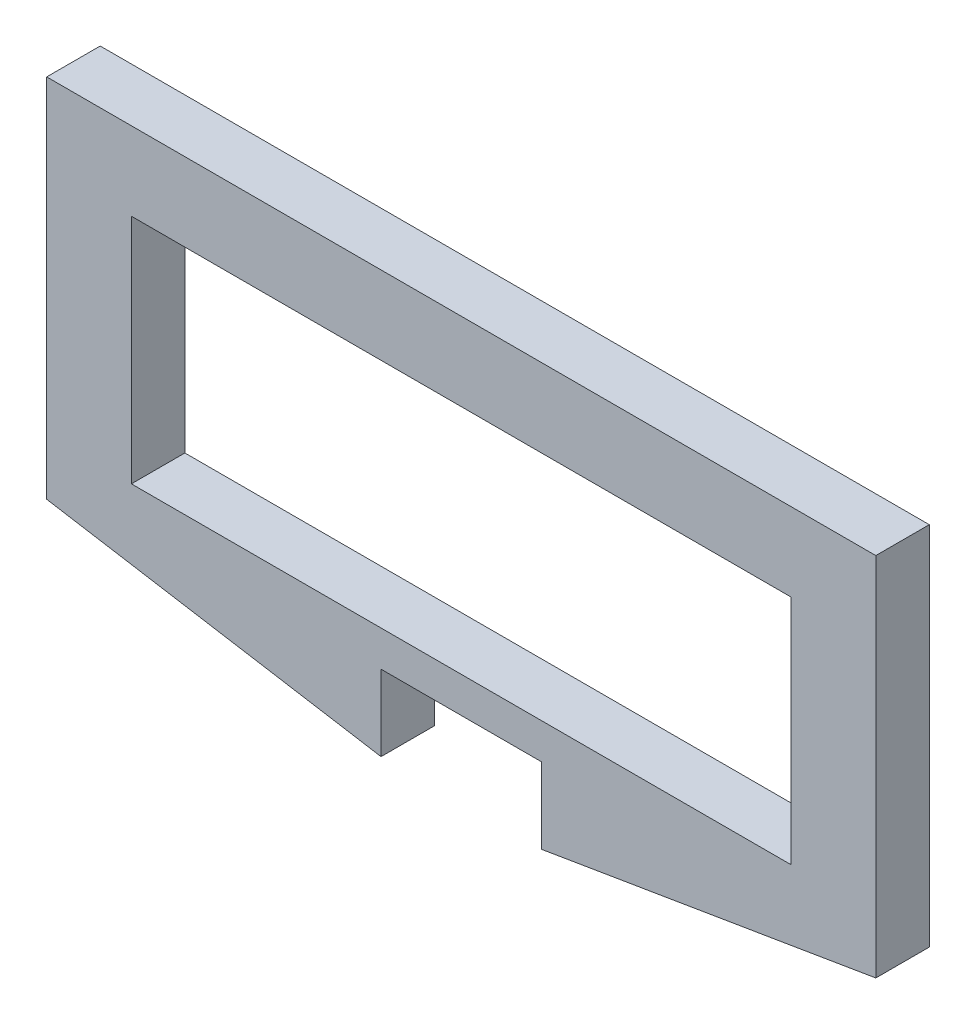
ISO-10303-21;
HEADER;
FILE_DESCRIPTION(('STEP AP214'),'2;1');
FILE_NAME('part.step','',(''),(''),'','','');
FILE_SCHEMA(('AUTOMOTIVE_DESIGN { 1 0 10303 214 1 1 1 1 }'));
ENDSEC;
DATA;
#1=APPLICATION_CONTEXT('core data for automotive mechanical design processes');
#2=APPLICATION_PROTOCOL_DEFINITION('international standard','automotive_design',2000,#1);
#3=PRODUCT_CONTEXT('',#1,'mechanical');
#4=PRODUCT('Part','Part','',(#3));
#5=PRODUCT_RELATED_PRODUCT_CATEGORY('part','',(#4));
#6=PRODUCT_DEFINITION_FORMATION('','',#4);
#7=PRODUCT_DEFINITION_CONTEXT('part definition',#1,'design');
#8=PRODUCT_DEFINITION('design','',#6,#7);
#9=PRODUCT_DEFINITION_SHAPE('','',#8);
#10=(LENGTH_UNIT() NAMED_UNIT(*) SI_UNIT(.MILLI.,.METRE.));
#11=(NAMED_UNIT(*) PLANE_ANGLE_UNIT() SI_UNIT($,.RADIAN.));
#12=(NAMED_UNIT(*) SI_UNIT($,.STERADIAN.) SOLID_ANGLE_UNIT());
#13=UNCERTAINTY_MEASURE_WITH_UNIT(LENGTH_MEASURE(1.E-05),#10,'distance_accuracy_value','');
#14=(GEOMETRIC_REPRESENTATION_CONTEXT(3) GLOBAL_UNCERTAINTY_ASSIGNED_CONTEXT((#13)) GLOBAL_UNIT_ASSIGNED_CONTEXT((#10,
#11,#12)) REPRESENTATION_CONTEXT('',''));
#15=CARTESIAN_POINT('',(0.,0.,0.));
#16=DIRECTION('',(0.,0.,1.));
#17=DIRECTION('',(1.,0.,0.));
#18=AXIS2_PLACEMENT_3D('',#15,#16,#17);
#19=CARTESIAN_POINT('',(0.,0.,30.));
#20=DIRECTION('',(0.,0.,1.));
#21=DIRECTION('',(1.,0.,0.));
#22=AXIS2_PLACEMENT_3D('',#19,#20,#21);
#23=PLANE('',#22);
#24=DIRECTION('',(0.,-1.,0.));
#25=VECTOR('',#24,1.);
#26=CARTESIAN_POINT('',(-232.49,9.89118189426478,30.));
#27=LINE('',#26,#25);
#28=CARTESIAN_POINT('',(-232.49,9.89118189426478,30.));
#29=VERTEX_POINT('',#28);
#30=CARTESIAN_POINT('',(-232.49,-195.288818105735,30.));
#31=VERTEX_POINT('',#30);
#32=EDGE_CURVE('E157',#29,#31,#27,.T.);
#33=ORIENTED_EDGE('',*,*,#32,.T.);
#34=DIRECTION('',(0.986400586141853,-0.164359008451041,0.));
#35=VECTOR('',#34,1.);
#36=CARTESIAN_POINT('',(-232.49,-195.288818105735,30.));
#37=LINE('',#36,#35);
#38=CARTESIAN_POINT('',(-45.,-226.529341405723,30.));
#39=VERTEX_POINT('',#38);
#40=EDGE_CURVE('E160',#31,#39,#37,.T.);
#41=ORIENTED_EDGE('',*,*,#40,.T.);
#42=DIRECTION('',(0.,1.,0.));
#43=VECTOR('',#42,1.);
#44=CARTESIAN_POINT('',(-45.,-226.529341405723,30.));
#45=LINE('',#44,#43);
#46=CARTESIAN_POINT('',(-45.,-184.029341405723,30.));
#47=VERTEX_POINT('',#46);
#48=EDGE_CURVE('E163',#39,#47,#45,.T.);
#49=ORIENTED_EDGE('',*,*,#48,.T.);
#50=DIRECTION('',(1.,0.,0.));
#51=VECTOR('',#50,1.);
#52=CARTESIAN_POINT('',(-45.,-184.029341405723,30.));
#53=LINE('',#52,#51);
#54=CARTESIAN_POINT('',(45.,-184.029341405723,30.));
#55=VERTEX_POINT('',#54);
#56=EDGE_CURVE('E165',#47,#55,#53,.T.);
#57=ORIENTED_EDGE('',*,*,#56,.T.);
#58=DIRECTION('',(0.,-1.,0.));
#59=VECTOR('',#58,1.);
#60=CARTESIAN_POINT('',(45.,-226.529341405723,30.));
#61=LINE('',#60,#59);
#62=CARTESIAN_POINT('',(45.,-226.529341405723,30.));
#63=VERTEX_POINT('',#62);
#64=EDGE_CURVE('E167',#55,#63,#61,.T.);
#65=ORIENTED_EDGE('',*,*,#64,.T.);
#66=DIRECTION('',(0.986400586141853,0.164359008451041,0.));
#67=VECTOR('',#66,1.);
#68=CARTESIAN_POINT('',(232.49,-195.288818105735,30.));
#69=LINE('',#68,#67);
#70=CARTESIAN_POINT('',(232.49,-195.288818105735,30.));
#71=VERTEX_POINT('',#70);
#72=EDGE_CURVE('E169',#63,#71,#69,.T.);
#73=ORIENTED_EDGE('',*,*,#72,.T.);
#74=DIRECTION('',(0.,1.,0.));
#75=VECTOR('',#74,1.);
#76=CARTESIAN_POINT('',(232.49,9.89118189426467,30.));
#77=LINE('',#76,#75);
#78=CARTESIAN_POINT('',(232.49,9.89118189426467,30.));
#79=VERTEX_POINT('',#78);
#80=EDGE_CURVE('E171',#71,#79,#77,.T.);
#81=ORIENTED_EDGE('',*,*,#80,.T.);
#82=DIRECTION('',(-1.,0.,0.));
#83=VECTOR('',#82,1.);
#84=CARTESIAN_POINT('',(232.49,9.89118189426467,30.));
#85=LINE('',#84,#83);
#86=EDGE_CURVE('E173',#79,#29,#85,.T.);
#87=ORIENTED_EDGE('',*,*,#86,.T.);
#88=EDGE_LOOP('',(#33,#41,#49,#57,#65,#73,#81,#87));
#89=FACE_BOUND('',#88,.T.);
#90=DIRECTION('',(0.,-1.,0.));
#91=VECTOR('',#90,1.);
#92=CARTESIAN_POINT('',(-185.,-164.029341405723,30.));
#93=LINE('',#92,#91);
#94=CARTESIAN_POINT('',(-185.,-34.0293414057226,30.));
#95=VERTEX_POINT('',#94);
#96=CARTESIAN_POINT('',(-185.,-164.029341405723,30.));
#97=VERTEX_POINT('',#96);
#98=EDGE_CURVE('E129',#95,#97,#93,.T.);
#99=ORIENTED_EDGE('',*,*,#98,.F.);
#100=DIRECTION('',(-1.,0.,0.));
#101=VECTOR('',#100,1.);
#102=CARTESIAN_POINT('',(-185.,-34.0293414057226,30.));
#103=LINE('',#102,#101);
#104=CARTESIAN_POINT('',(185.,-34.0293414057226,30.));
#105=VERTEX_POINT('',#104);
#106=EDGE_CURVE('E121',#105,#95,#103,.T.);
#107=ORIENTED_EDGE('',*,*,#106,.F.);
#108=DIRECTION('',(0.,1.,0.));
#109=VECTOR('',#108,1.);
#110=CARTESIAN_POINT('',(185.,-164.029341405723,30.));
#111=LINE('',#110,#109);
#112=CARTESIAN_POINT('',(185.,-164.029341405723,30.));
#113=VERTEX_POINT('',#112);
#114=EDGE_CURVE('E143',#113,#105,#111,.T.);
#115=ORIENTED_EDGE('',*,*,#114,.F.);
#116=DIRECTION('',(1.,0.,0.));
#117=VECTOR('',#116,1.);
#118=CARTESIAN_POINT('',(185.,-164.029341405723,30.));
#119=LINE('',#118,#117);
#120=EDGE_CURVE('E141',#97,#113,#119,.T.);
#121=ORIENTED_EDGE('',*,*,#120,.F.);
#122=EDGE_LOOP('',(#99,#107,#115,#121));
#123=FACE_BOUND('',#122,.T.);
#124=ADVANCED_FACE('F32',(#89,#123),#23,.T.);
#125=CARTESIAN_POINT('',(0.,0.,0.));
#126=DIRECTION('',(0.,0.,1.));
#127=DIRECTION('',(1.,0.,0.));
#128=AXIS2_PLACEMENT_3D('',#125,#126,#127);
#129=PLANE('',#128);
#130=DIRECTION('',(0.,-1.,0.));
#131=VECTOR('',#130,1.);
#132=CARTESIAN_POINT('',(-232.49,9.89118189426478,0.));
#133=LINE('',#132,#131);
#134=CARTESIAN_POINT('',(-232.49,9.89118189426478,0.));
#135=VERTEX_POINT('',#134);
#136=CARTESIAN_POINT('',(-232.49,-195.288818105735,0.));
#137=VERTEX_POINT('',#136);
#138=EDGE_CURVE('E137',#135,#137,#133,.T.);
#139=ORIENTED_EDGE('',*,*,#138,.F.);
#140=DIRECTION('',(-1.,0.,0.));
#141=VECTOR('',#140,1.);
#142=CARTESIAN_POINT('',(232.49,9.89118189426467,0.));
#143=LINE('',#142,#141);
#144=CARTESIAN_POINT('',(232.49,9.89118189426467,0.));
#145=VERTEX_POINT('',#144);
#146=EDGE_CURVE('E161',#145,#135,#143,.T.);
#147=ORIENTED_EDGE('',*,*,#146,.F.);
#148=DIRECTION('',(0.,1.,0.));
#149=VECTOR('',#148,1.);
#150=CARTESIAN_POINT('',(232.49,9.89118189426467,0.));
#151=LINE('',#150,#149);
#152=CARTESIAN_POINT('',(232.49,-195.288818105735,0.));
#153=VERTEX_POINT('',#152);
#154=EDGE_CURVE('E188',#153,#145,#151,.T.);
#155=ORIENTED_EDGE('',*,*,#154,.F.);
#156=DIRECTION('',(0.986400586141853,0.164359008451041,0.));
#157=VECTOR('',#156,1.);
#158=CARTESIAN_POINT('',(232.49,-195.288818105735,0.));
#159=LINE('',#158,#157);
#160=CARTESIAN_POINT('',(45.,-226.529341405723,0.));
#161=VERTEX_POINT('',#160);
#162=EDGE_CURVE('E186',#161,#153,#159,.T.);
#163=ORIENTED_EDGE('',*,*,#162,.F.);
#164=DIRECTION('',(0.,-1.,0.));
#165=VECTOR('',#164,1.);
#166=CARTESIAN_POINT('',(45.,-226.529341405723,0.));
#167=LINE('',#166,#165);
#168=CARTESIAN_POINT('',(45.,-184.029341405723,0.));
#169=VERTEX_POINT('',#168);
#170=EDGE_CURVE('E184',#169,#161,#167,.T.);
#171=ORIENTED_EDGE('',*,*,#170,.F.);
#172=DIRECTION('',(1.,0.,0.));
#173=VECTOR('',#172,1.);
#174=CARTESIAN_POINT('',(-45.,-184.029341405723,0.));
#175=LINE('',#174,#173);
#176=CARTESIAN_POINT('',(-45.,-184.029341405723,0.));
#177=VERTEX_POINT('',#176);
#178=EDGE_CURVE('E182',#177,#169,#175,.T.);
#179=ORIENTED_EDGE('',*,*,#178,.F.);
#180=DIRECTION('',(0.,1.,0.));
#181=VECTOR('',#180,1.);
#182=CARTESIAN_POINT('',(-45.,-226.529341405723,0.));
#183=LINE('',#182,#181);
#184=CARTESIAN_POINT('',(-45.,-226.529341405723,0.));
#185=VERTEX_POINT('',#184);
#186=EDGE_CURVE('E180',#185,#177,#183,.T.);
#187=ORIENTED_EDGE('',*,*,#186,.F.);
#188=DIRECTION('',(0.986400586141853,-0.164359008451041,0.));
#189=VECTOR('',#188,1.);
#190=CARTESIAN_POINT('',(-232.49,-195.288818105735,0.));
#191=LINE('',#190,#189);
#192=EDGE_CURVE('E178',#137,#185,#191,.T.);
#193=ORIENTED_EDGE('',*,*,#192,.F.);
#194=EDGE_LOOP('',(#139,#147,#155,#163,#171,#179,#187,#193));
#195=FACE_BOUND('',#194,.T.);
#196=DIRECTION('',(-1.,0.,0.));
#197=VECTOR('',#196,1.);
#198=CARTESIAN_POINT('',(-185.,-34.0293414057226,0.));
#199=LINE('',#198,#197);
#200=CARTESIAN_POINT('',(185.,-34.0293414057226,0.));
#201=VERTEX_POINT('',#200);
#202=CARTESIAN_POINT('',(-185.,-34.0293414057226,0.));
#203=VERTEX_POINT('',#202);
#204=EDGE_CURVE('E55',#201,#203,#199,.T.);
#205=ORIENTED_EDGE('',*,*,#204,.T.);
#206=DIRECTION('',(0.,-1.,0.));
#207=VECTOR('',#206,1.);
#208=CARTESIAN_POINT('',(-185.,-164.029341405723,0.));
#209=LINE('',#208,#207);
#210=CARTESIAN_POINT('',(-185.,-164.029341405723,0.));
#211=VERTEX_POINT('',#210);
#212=EDGE_CURVE('E136',#203,#211,#209,.T.);
#213=ORIENTED_EDGE('',*,*,#212,.T.);
#214=DIRECTION('',(1.,0.,0.));
#215=VECTOR('',#214,1.);
#216=CARTESIAN_POINT('',(185.,-164.029341405723,0.));
#217=LINE('',#216,#215);
#218=CARTESIAN_POINT('',(185.,-164.029341405723,0.));
#219=VERTEX_POINT('',#218);
#220=EDGE_CURVE('E149',#211,#219,#217,.T.);
#221=ORIENTED_EDGE('',*,*,#220,.T.);
#222=DIRECTION('',(0.,1.,0.));
#223=VECTOR('',#222,1.);
#224=CARTESIAN_POINT('',(185.,-164.029341405723,0.));
#225=LINE('',#224,#223);
#226=EDGE_CURVE('E130',#219,#201,#225,.T.);
#227=ORIENTED_EDGE('',*,*,#226,.T.);
#228=EDGE_LOOP('',(#205,#213,#221,#227));
#229=FACE_BOUND('',#228,.T.);
#230=ADVANCED_FACE('F218',(#195,#229),#129,.F.);
#231=CARTESIAN_POINT('',(-232.49,9.89118189426478,30.));
#232=DIRECTION('',(1.,0.,0.));
#233=DIRECTION('',(0.,1.,0.));
#234=AXIS2_PLACEMENT_3D('',#231,#232,#233);
#235=PLANE('',#234);
#236=ORIENTED_EDGE('',*,*,#138,.T.);
#237=DIRECTION('',(0.,0.,-1.));
#238=VECTOR('',#237,1.);
#239=CARTESIAN_POINT('',(-232.49,-195.288818105735,30.));
#240=LINE('',#239,#238);
#241=EDGE_CURVE('E11',#31,#137,#240,.T.);
#242=ORIENTED_EDGE('',*,*,#241,.F.);
#243=ORIENTED_EDGE('',*,*,#32,.F.);
#244=DIRECTION('',(0.,0.,-1.));
#245=VECTOR('',#244,1.);
#246=CARTESIAN_POINT('',(-232.49,9.89118189426478,30.));
#247=LINE('',#246,#245);
#248=EDGE_CURVE('E175',#29,#135,#247,.T.);
#249=ORIENTED_EDGE('',*,*,#248,.T.);
#250=EDGE_LOOP('',(#236,#242,#243,#249));
#251=FACE_BOUND('',#250,.T.);
#252=ADVANCED_FACE('F34',(#251),#235,.F.);
#253=CARTESIAN_POINT('',(-232.49,-195.288818105735,30.));
#254=DIRECTION('',(0.164359008451041,0.986400586141853,0.));
#255=DIRECTION('',(-0.986400586141853,0.164359008451041,0.));
#256=AXIS2_PLACEMENT_3D('',#253,#254,#255);
#257=PLANE('',#256);
#258=ORIENTED_EDGE('',*,*,#192,.T.);
#259=DIRECTION('',(0.,0.,-1.));
#260=VECTOR('',#259,1.);
#261=CARTESIAN_POINT('',(-45.,-226.529341405723,30.));
#262=LINE('',#261,#260);
#263=EDGE_CURVE('E40',#39,#185,#262,.T.);
#264=ORIENTED_EDGE('',*,*,#263,.F.);
#265=ORIENTED_EDGE('',*,*,#40,.F.);
#266=ORIENTED_EDGE('',*,*,#241,.T.);
#267=EDGE_LOOP('',(#258,#264,#265,#266));
#268=FACE_BOUND('',#267,.T.);
#269=ADVANCED_FACE('F235',(#268),#257,.F.);
#270=CARTESIAN_POINT('',(-45.,-226.529341405723,30.));
#271=DIRECTION('',(-1.,0.,0.));
#272=DIRECTION('',(0.,-1.,0.));
#273=AXIS2_PLACEMENT_3D('',#270,#271,#272);
#274=PLANE('',#273);
#275=ORIENTED_EDGE('',*,*,#186,.T.);
#276=DIRECTION('',(0.,0.,-1.));
#277=VECTOR('',#276,1.);
#278=CARTESIAN_POINT('',(-45.,-184.029341405723,30.));
#279=LINE('',#278,#277);
#280=EDGE_CURVE('E205',#47,#177,#279,.T.);
#281=ORIENTED_EDGE('',*,*,#280,.F.);
#282=ORIENTED_EDGE('',*,*,#48,.F.);
#283=ORIENTED_EDGE('',*,*,#263,.T.);
#284=EDGE_LOOP('',(#275,#281,#282,#283));
#285=FACE_BOUND('',#284,.T.);
#286=ADVANCED_FACE('F212',(#285),#274,.F.);
#287=CARTESIAN_POINT('',(-45.,-184.029341405723,30.));
#288=DIRECTION('',(0.,1.,0.));
#289=DIRECTION('',(-1.,0.,0.));
#290=AXIS2_PLACEMENT_3D('',#287,#288,#289);
#291=PLANE('',#290);
#292=ORIENTED_EDGE('',*,*,#178,.T.);
#293=DIRECTION('',(0.,0.,-1.));
#294=VECTOR('',#293,1.);
#295=CARTESIAN_POINT('',(45.,-184.029341405723,30.));
#296=LINE('',#295,#294);
#297=EDGE_CURVE('E202',#55,#169,#296,.T.);
#298=ORIENTED_EDGE('',*,*,#297,.F.);
#299=ORIENTED_EDGE('',*,*,#56,.F.);
#300=ORIENTED_EDGE('',*,*,#280,.T.);
#301=EDGE_LOOP('',(#292,#298,#299,#300));
#302=FACE_BOUND('',#301,.T.);
#303=ADVANCED_FACE('F224',(#302),#291,.F.);
#304=CARTESIAN_POINT('',(45.,-226.529341405723,30.));
#305=DIRECTION('',(1.,0.,0.));
#306=DIRECTION('',(0.,1.,0.));
#307=AXIS2_PLACEMENT_3D('',#304,#305,#306);
#308=PLANE('',#307);
#309=ORIENTED_EDGE('',*,*,#170,.T.);
#310=DIRECTION('',(0.,0.,-1.));
#311=VECTOR('',#310,1.);
#312=CARTESIAN_POINT('',(45.,-226.529341405723,30.));
#313=LINE('',#312,#311);
#314=EDGE_CURVE('E199',#63,#161,#313,.T.);
#315=ORIENTED_EDGE('',*,*,#314,.F.);
#316=ORIENTED_EDGE('',*,*,#64,.F.);
#317=ORIENTED_EDGE('',*,*,#297,.T.);
#318=EDGE_LOOP('',(#309,#315,#316,#317));
#319=FACE_BOUND('',#318,.T.);
#320=ADVANCED_FACE('F228',(#319),#308,.F.);
#321=CARTESIAN_POINT('',(232.49,-195.288818105735,30.));
#322=DIRECTION('',(-0.164359008451041,0.986400586141853,0.));
#323=DIRECTION('',(-0.986400586141853,-0.164359008451041,0.));
#324=AXIS2_PLACEMENT_3D('',#321,#322,#323);
#325=PLANE('',#324);
#326=ORIENTED_EDGE('',*,*,#162,.T.);
#327=DIRECTION('',(0.,0.,-1.));
#328=VECTOR('',#327,1.);
#329=CARTESIAN_POINT('',(232.49,-195.288818105735,30.));
#330=LINE('',#329,#328);
#331=EDGE_CURVE('E196',#71,#153,#330,.T.);
#332=ORIENTED_EDGE('',*,*,#331,.F.);
#333=ORIENTED_EDGE('',*,*,#72,.F.);
#334=ORIENTED_EDGE('',*,*,#314,.T.);
#335=EDGE_LOOP('',(#326,#332,#333,#334));
#336=FACE_BOUND('',#335,.T.);
#337=ADVANCED_FACE('F248',(#336),#325,.F.);
#338=CARTESIAN_POINT('',(232.49,9.89118189426467,30.));
#339=DIRECTION('',(-1.,0.,0.));
#340=DIRECTION('',(0.,-1.,0.));
#341=AXIS2_PLACEMENT_3D('',#338,#339,#340);
#342=PLANE('',#341);
#343=ORIENTED_EDGE('',*,*,#154,.T.);
#344=DIRECTION('',(0.,0.,-1.));
#345=VECTOR('',#344,1.);
#346=CARTESIAN_POINT('',(232.49,9.89118189426467,30.));
#347=LINE('',#346,#345);
#348=EDGE_CURVE('E193',#79,#145,#347,.T.);
#349=ORIENTED_EDGE('',*,*,#348,.F.);
#350=ORIENTED_EDGE('',*,*,#80,.F.);
#351=ORIENTED_EDGE('',*,*,#331,.T.);
#352=EDGE_LOOP('',(#343,#349,#350,#351));
#353=FACE_BOUND('',#352,.T.);
#354=ADVANCED_FACE('F246',(#353),#342,.F.);
#355=CARTESIAN_POINT('',(232.49,9.89118189426467,30.));
#356=DIRECTION('',(0.,-1.,0.));
#357=DIRECTION('',(1.,0.,0.));
#358=AXIS2_PLACEMENT_3D('',#355,#356,#357);
#359=PLANE('',#358);
#360=ORIENTED_EDGE('',*,*,#146,.T.);
#361=ORIENTED_EDGE('',*,*,#248,.F.);
#362=ORIENTED_EDGE('',*,*,#86,.F.);
#363=ORIENTED_EDGE('',*,*,#348,.T.);
#364=EDGE_LOOP('',(#360,#361,#362,#363));
#365=FACE_BOUND('',#364,.T.);
#366=ADVANCED_FACE('F241',(#365),#359,.F.);
#367=CARTESIAN_POINT('',(-185.,-34.0293414057226,30.));
#368=DIRECTION('',(0.,-1.,0.));
#369=DIRECTION('',(1.,0.,0.));
#370=AXIS2_PLACEMENT_3D('',#367,#368,#369);
#371=PLANE('',#370);
#372=ORIENTED_EDGE('',*,*,#204,.F.);
#373=DIRECTION('',(0.,0.,-1.));
#374=VECTOR('',#373,1.);
#375=CARTESIAN_POINT('',(185.,-34.0293414057226,30.));
#376=LINE('',#375,#374);
#377=EDGE_CURVE('E125',#105,#201,#376,.T.);
#378=ORIENTED_EDGE('',*,*,#377,.F.);
#379=ORIENTED_EDGE('',*,*,#106,.T.);
#380=DIRECTION('',(0.,0.,-1.));
#381=VECTOR('',#380,1.);
#382=CARTESIAN_POINT('',(-185.,-34.0293414057226,30.));
#383=LINE('',#382,#381);
#384=EDGE_CURVE('E124',#95,#203,#383,.T.);
#385=ORIENTED_EDGE('',*,*,#384,.T.);
#386=EDGE_LOOP('',(#372,#378,#379,#385));
#387=FACE_BOUND('',#386,.T.);
#388=ADVANCED_FACE('F123',(#387),#371,.T.);
#389=CARTESIAN_POINT('',(-185.,-164.029341405723,30.));
#390=DIRECTION('',(1.,0.,0.));
#391=DIRECTION('',(0.,0.,-1.));
#392=AXIS2_PLACEMENT_3D('',#389,#390,#391);
#393=PLANE('',#392);
#394=ORIENTED_EDGE('',*,*,#212,.F.);
#395=ORIENTED_EDGE('',*,*,#384,.F.);
#396=ORIENTED_EDGE('',*,*,#98,.T.);
#397=DIRECTION('',(0.,0.,-1.));
#398=VECTOR('',#397,1.);
#399=CARTESIAN_POINT('',(-185.,-164.029341405723,30.));
#400=LINE('',#399,#398);
#401=EDGE_CURVE('E138',#97,#211,#400,.T.);
#402=ORIENTED_EDGE('',*,*,#401,.T.);
#403=EDGE_LOOP('',(#394,#395,#396,#402));
#404=FACE_BOUND('',#403,.T.);
#405=ADVANCED_FACE('F133',(#404),#393,.T.);
#406=CARTESIAN_POINT('',(185.,-164.029341405723,30.));
#407=DIRECTION('',(0.,1.,0.));
#408=DIRECTION('',(-1.,0.,0.));
#409=AXIS2_PLACEMENT_3D('',#406,#407,#408);
#410=PLANE('',#409);
#411=ORIENTED_EDGE('',*,*,#220,.F.);
#412=ORIENTED_EDGE('',*,*,#401,.F.);
#413=ORIENTED_EDGE('',*,*,#120,.T.);
#414=DIRECTION('',(0.,0.,-1.));
#415=VECTOR('',#414,1.);
#416=CARTESIAN_POINT('',(185.,-164.029341405723,30.));
#417=LINE('',#416,#415);
#418=EDGE_CURVE('E47',#113,#219,#417,.T.);
#419=ORIENTED_EDGE('',*,*,#418,.T.);
#420=EDGE_LOOP('',(#411,#412,#413,#419));
#421=FACE_BOUND('',#420,.T.);
#422=ADVANCED_FACE('F273',(#421),#410,.T.);
#423=CARTESIAN_POINT('',(185.,-164.029341405723,30.));
#424=DIRECTION('',(-1.,0.,0.));
#425=DIRECTION('',(0.,0.,1.));
#426=AXIS2_PLACEMENT_3D('',#423,#424,#425);
#427=PLANE('',#426);
#428=ORIENTED_EDGE('',*,*,#226,.F.);
#429=ORIENTED_EDGE('',*,*,#418,.F.);
#430=ORIENTED_EDGE('',*,*,#114,.T.);
#431=ORIENTED_EDGE('',*,*,#377,.T.);
#432=EDGE_LOOP('',(#428,#429,#430,#431));
#433=FACE_BOUND('',#432,.T.);
#434=ADVANCED_FACE('F277',(#433),#427,.T.);
#435=CLOSED_SHELL('',(#124,#230,#252,#269,#286,#303,#320,#337,#354,#366,#388,#405,#422,#434));
#436=MANIFOLD_SOLID_BREP('B2',#435);
#437=ADVANCED_BREP_SHAPE_REPRESENTATION('',(#18,#436),#14);
#438=SHAPE_DEFINITION_REPRESENTATION(#9,#437);
ENDSEC;
END-ISO-10303-21;
